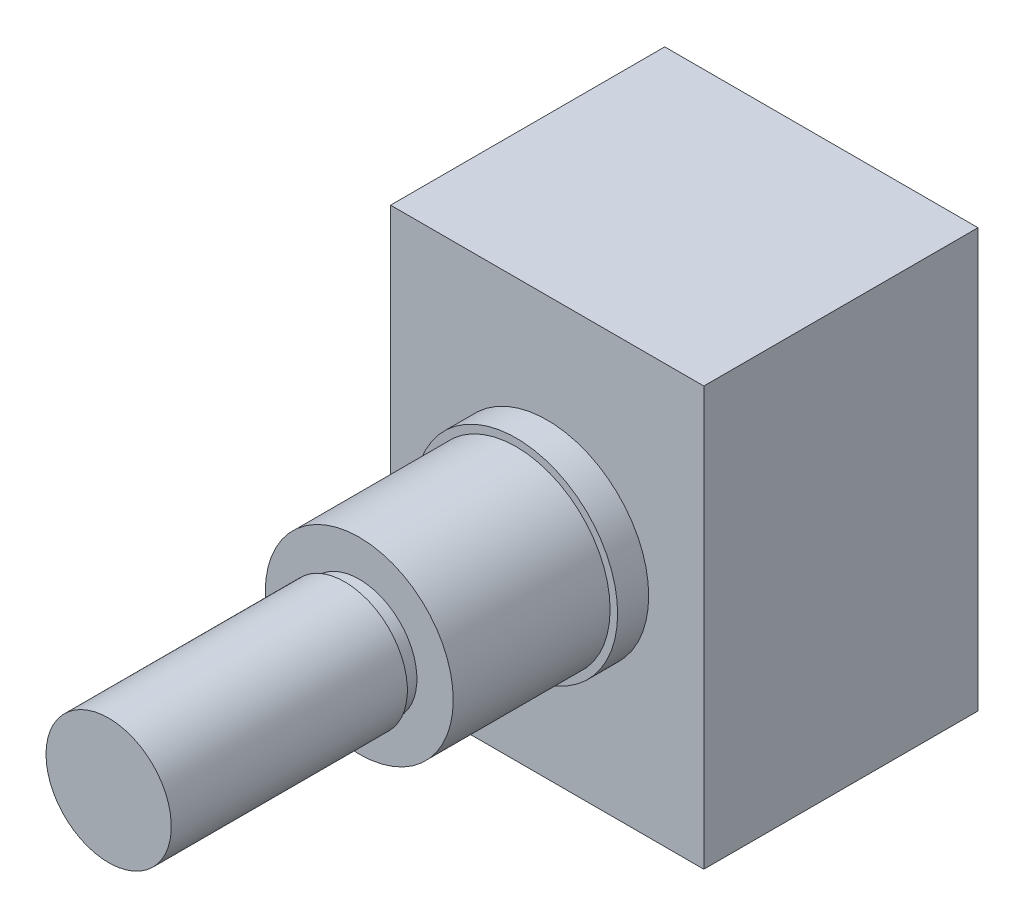
ISO-10303-21;
HEADER;
FILE_DESCRIPTION(('STEP AP214'),'2;1');
FILE_NAME('part.step','',(''),(''),'','','');
FILE_SCHEMA(('AUTOMOTIVE_DESIGN { 1 0 10303 214 1 1 1 1 }'));
ENDSEC;
DATA;
#1=APPLICATION_CONTEXT('core data for automotive mechanical design processes');
#2=APPLICATION_PROTOCOL_DEFINITION('international standard','automotive_design',2000,#1);
#3=PRODUCT_CONTEXT('',#1,'mechanical');
#4=PRODUCT('Part','Part','',(#3));
#5=PRODUCT_RELATED_PRODUCT_CATEGORY('part','',(#4));
#6=PRODUCT_DEFINITION_FORMATION('','',#4);
#7=PRODUCT_DEFINITION_CONTEXT('part definition',#1,'design');
#8=PRODUCT_DEFINITION('design','',#6,#7);
#9=PRODUCT_DEFINITION_SHAPE('','',#8);
#10=(LENGTH_UNIT() NAMED_UNIT(*) SI_UNIT(.MILLI.,.METRE.));
#11=(NAMED_UNIT(*) PLANE_ANGLE_UNIT() SI_UNIT($,.RADIAN.));
#12=(NAMED_UNIT(*) SI_UNIT($,.STERADIAN.) SOLID_ANGLE_UNIT());
#13=UNCERTAINTY_MEASURE_WITH_UNIT(LENGTH_MEASURE(1.E-05),#10,'distance_accuracy_value','');
#14=(GEOMETRIC_REPRESENTATION_CONTEXT(3) GLOBAL_UNCERTAINTY_ASSIGNED_CONTEXT((#13)) GLOBAL_UNIT_ASSIGNED_CONTEXT((#10,
#11,#12)) REPRESENTATION_CONTEXT('',''));
#15=CARTESIAN_POINT('',(0.,0.,0.));
#16=DIRECTION('',(0.,0.,1.));
#17=DIRECTION('',(1.,0.,0.));
#18=AXIS2_PLACEMENT_3D('',#15,#16,#17);
#19=CARTESIAN_POINT('',(-7.9375,-10.6045,0.));
#20=DIRECTION('',(0.,-1.,0.));
#21=DIRECTION('',(0.,0.,-1.));
#22=AXIS2_PLACEMENT_3D('',#19,#20,#21);
#23=PLANE('',#22);
#24=DIRECTION('',(1.,0.,0.));
#25=VECTOR('',#24,1.);
#26=CARTESIAN_POINT('',(-7.9375,-10.6045,13.8938));
#27=LINE('',#26,#25);
#28=CARTESIAN_POINT('',(-7.9375,-10.6045,13.8938));
#29=VERTEX_POINT('',#28);
#30=CARTESIAN_POINT('',(7.9375,-10.6045,13.8938));
#31=VERTEX_POINT('',#30);
#32=EDGE_CURVE('E98',#29,#31,#27,.T.);
#33=ORIENTED_EDGE('',*,*,#32,.F.);
#34=DIRECTION('',(0.,0.,1.));
#35=VECTOR('',#34,1.);
#36=CARTESIAN_POINT('',(-7.9375,-10.6045,0.));
#37=LINE('',#36,#35);
#38=CARTESIAN_POINT('',(-7.9375,-10.6045,0.));
#39=VERTEX_POINT('',#38);
#40=EDGE_CURVE('E11',#39,#29,#37,.T.);
#41=ORIENTED_EDGE('',*,*,#40,.F.);
#42=DIRECTION('',(1.,0.,0.));
#43=VECTOR('',#42,1.);
#44=CARTESIAN_POINT('',(-7.9375,-10.6045,0.));
#45=LINE('',#44,#43);
#46=CARTESIAN_POINT('',(7.9375,-10.6045,0.));
#47=VERTEX_POINT('',#46);
#48=EDGE_CURVE('E91',#39,#47,#45,.T.);
#49=ORIENTED_EDGE('',*,*,#48,.T.);
#50=DIRECTION('',(0.,0.,1.));
#51=VECTOR('',#50,1.);
#52=CARTESIAN_POINT('',(7.9375,-10.6045,0.));
#53=LINE('',#52,#51);
#54=EDGE_CURVE('E36',#47,#31,#53,.T.);
#55=ORIENTED_EDGE('',*,*,#54,.T.);
#56=EDGE_LOOP('',(#33,#41,#49,#55));
#57=FACE_BOUND('',#56,.T.);
#58=ADVANCED_FACE('F33',(#57),#23,.T.);
#59=CARTESIAN_POINT('',(-7.9375,10.6045,0.));
#60=DIRECTION('',(-1.,0.,0.));
#61=DIRECTION('',(0.,0.,1.));
#62=AXIS2_PLACEMENT_3D('',#59,#60,#61);
#63=PLANE('',#62);
#64=DIRECTION('',(0.,-1.,0.));
#65=VECTOR('',#64,1.);
#66=CARTESIAN_POINT('',(-7.9375,10.6045,13.8938));
#67=LINE('',#66,#65);
#68=CARTESIAN_POINT('',(-7.9375,10.6045,13.8938));
#69=VERTEX_POINT('',#68);
#70=EDGE_CURVE('E93',#69,#29,#67,.T.);
#71=ORIENTED_EDGE('',*,*,#70,.F.);
#72=DIRECTION('',(0.,0.,1.));
#73=VECTOR('',#72,1.);
#74=CARTESIAN_POINT('',(-7.9375,10.6045,0.));
#75=LINE('',#74,#73);
#76=CARTESIAN_POINT('',(-7.9375,10.6045,0.));
#77=VERTEX_POINT('',#76);
#78=EDGE_CURVE('E42',#77,#69,#75,.T.);
#79=ORIENTED_EDGE('',*,*,#78,.F.);
#80=DIRECTION('',(0.,-1.,0.));
#81=VECTOR('',#80,1.);
#82=CARTESIAN_POINT('',(-7.9375,10.6045,0.));
#83=LINE('',#82,#81);
#84=EDGE_CURVE('E88',#77,#39,#83,.T.);
#85=ORIENTED_EDGE('',*,*,#84,.T.);
#86=ORIENTED_EDGE('',*,*,#40,.T.);
#87=EDGE_LOOP('',(#71,#79,#85,#86));
#88=FACE_BOUND('',#87,.T.);
#89=ADVANCED_FACE('F109',(#88),#63,.T.);
#90=CARTESIAN_POINT('',(7.9375,10.6045,0.));
#91=DIRECTION('',(0.,1.,0.));
#92=DIRECTION('',(0.,0.,1.));
#93=AXIS2_PLACEMENT_3D('',#90,#91,#92);
#94=PLANE('',#93);
#95=DIRECTION('',(-1.,0.,0.));
#96=VECTOR('',#95,1.);
#97=CARTESIAN_POINT('',(7.9375,10.6045,13.8938));
#98=LINE('',#97,#96);
#99=CARTESIAN_POINT('',(7.9375,10.6045,13.8938));
#100=VERTEX_POINT('',#99);
#101=EDGE_CURVE('E83',#100,#69,#98,.T.);
#102=ORIENTED_EDGE('',*,*,#101,.F.);
#103=DIRECTION('',(0.,0.,1.));
#104=VECTOR('',#103,1.);
#105=CARTESIAN_POINT('',(7.9375,10.6045,0.));
#106=LINE('',#105,#104);
#107=CARTESIAN_POINT('',(7.9375,10.6045,0.));
#108=VERTEX_POINT('',#107);
#109=EDGE_CURVE('E78',#108,#100,#106,.T.);
#110=ORIENTED_EDGE('',*,*,#109,.F.);
#111=DIRECTION('',(-1.,0.,0.));
#112=VECTOR('',#111,1.);
#113=CARTESIAN_POINT('',(7.9375,10.6045,0.));
#114=LINE('',#113,#112);
#115=EDGE_CURVE('E81',#108,#77,#114,.T.);
#116=ORIENTED_EDGE('',*,*,#115,.T.);
#117=ORIENTED_EDGE('',*,*,#78,.T.);
#118=EDGE_LOOP('',(#102,#110,#116,#117));
#119=FACE_BOUND('',#118,.T.);
#120=ADVANCED_FACE('F80',(#119),#94,.T.);
#121=CARTESIAN_POINT('',(7.9375,-10.6045,0.));
#122=DIRECTION('',(1.,0.,0.));
#123=DIRECTION('',(0.,0.,-1.));
#124=AXIS2_PLACEMENT_3D('',#121,#122,#123);
#125=PLANE('',#124);
#126=DIRECTION('',(0.,1.,0.));
#127=VECTOR('',#126,1.);
#128=CARTESIAN_POINT('',(7.9375,-10.6045,13.8938));
#129=LINE('',#128,#127);
#130=EDGE_CURVE('E101',#31,#100,#129,.T.);
#131=ORIENTED_EDGE('',*,*,#130,.F.);
#132=ORIENTED_EDGE('',*,*,#54,.F.);
#133=DIRECTION('',(0.,1.,0.));
#134=VECTOR('',#133,1.);
#135=CARTESIAN_POINT('',(7.9375,-10.6045,0.));
#136=LINE('',#135,#134);
#137=EDGE_CURVE('E87',#47,#108,#136,.T.);
#138=ORIENTED_EDGE('',*,*,#137,.T.);
#139=ORIENTED_EDGE('',*,*,#109,.T.);
#140=EDGE_LOOP('',(#131,#132,#138,#139));
#141=FACE_BOUND('',#140,.T.);
#142=ADVANCED_FACE('F90',(#141),#125,.T.);
#143=CARTESIAN_POINT('',(0.,0.,0.));
#144=DIRECTION('',(0.,0.,1.));
#145=DIRECTION('',(1.,0.,0.));
#146=AXIS2_PLACEMENT_3D('',#143,#144,#145);
#147=PLANE('',#146);
#148=ORIENTED_EDGE('',*,*,#48,.F.);
#149=ORIENTED_EDGE('',*,*,#84,.F.);
#150=ORIENTED_EDGE('',*,*,#115,.F.);
#151=ORIENTED_EDGE('',*,*,#137,.F.);
#152=EDGE_LOOP('',(#148,#149,#150,#151));
#153=FACE_BOUND('',#152,.T.);
#154=ADVANCED_FACE('F86',(#153),#147,.F.);
#155=CARTESIAN_POINT('',(0.,0.,13.8938));
#156=DIRECTION('',(0.,0.,1.));
#157=DIRECTION('',(1.,0.,0.));
#158=AXIS2_PLACEMENT_3D('',#155,#156,#157);
#159=PLANE('',#158);
#160=CARTESIAN_POINT('',(0.,0.,13.8938));
#161=DIRECTION('',(0.,0.,-1.));
#162=DIRECTION('',(-1.,0.,0.));
#163=AXIS2_PLACEMENT_3D('',#160,#161,#162);
#164=CIRCLE('',#163,5.1435);
#165=CARTESIAN_POINT('',(-5.1435,0.,13.8938));
#166=VERTEX_POINT('',#165);
#167=EDGE_CURVE('E183',#166,#166,#164,.T.);
#168=ORIENTED_EDGE('',*,*,#167,.T.);
#169=EDGE_LOOP('',(#168));
#170=FACE_BOUND('',#169,.T.);
#171=ORIENTED_EDGE('',*,*,#32,.T.);
#172=ORIENTED_EDGE('',*,*,#130,.T.);
#173=ORIENTED_EDGE('',*,*,#101,.T.);
#174=ORIENTED_EDGE('',*,*,#70,.T.);
#175=EDGE_LOOP('',(#171,#172,#173,#174));
#176=FACE_BOUND('',#175,.T.);
#177=ADVANCED_FACE('F108',(#170,#176),#159,.T.);
#178=CARTESIAN_POINT('',(0.,0.,36.1188));
#179=DIRECTION('',(0.,0.,-1.));
#180=DIRECTION('',(-1.,0.,0.));
#181=AXIS2_PLACEMENT_3D('',#178,#179,#180);
#182=CYLINDRICAL_SURFACE('',#181,3.175);
#183=CARTESIAN_POINT('',(0.,0.,36.1188));
#184=DIRECTION('',(0.,0.,-1.));
#185=DIRECTION('',(-1.,0.,0.));
#186=AXIS2_PLACEMENT_3D('',#183,#184,#185);
#187=CIRCLE('',#186,3.175);
#188=CARTESIAN_POINT('',(-3.175,0.,36.1188));
#189=VERTEX_POINT('',#188);
#190=EDGE_CURVE('E102',#189,#189,#187,.T.);
#191=ORIENTED_EDGE('',*,*,#190,.T.);
#192=EDGE_LOOP('',(#191));
#193=FACE_BOUND('',#192,.T.);
#194=CARTESIAN_POINT('',(0.,0.,24.1554));
#195=DIRECTION('',(0.,0.,-1.));
#196=DIRECTION('',(-1.,0.,0.));
#197=AXIS2_PLACEMENT_3D('',#194,#195,#196);
#198=CIRCLE('',#197,3.175);
#199=CARTESIAN_POINT('',(-3.175,0.,24.1554));
#200=VERTEX_POINT('',#199);
#201=EDGE_CURVE('E164',#200,#200,#198,.T.);
#202=ORIENTED_EDGE('',*,*,#201,.F.);
#203=EDGE_LOOP('',(#202));
#204=FACE_BOUND('',#203,.T.);
#205=ADVANCED_FACE('F126',(#193,#204),#182,.T.);
#206=CARTESIAN_POINT('',(3.175,0.,36.1188));
#207=DIRECTION('',(0.,0.,1.));
#208=DIRECTION('',(1.,0.,0.));
#209=AXIS2_PLACEMENT_3D('',#206,#207,#208);
#210=PLANE('',#209);
#211=ORIENTED_EDGE('',*,*,#190,.F.);
#212=EDGE_LOOP('',(#211));
#213=FACE_BOUND('',#212,.T.);
#214=ADVANCED_FACE('F131',(#213),#210,.T.);
#215=CARTESIAN_POINT('',(0.,0.,36.1188));
#216=DIRECTION('',(0.,0.,-1.));
#217=DIRECTION('',(-1.,0.,0.));
#218=AXIS2_PLACEMENT_3D('',#215,#216,#217);
#219=CYLINDRICAL_SURFACE('',#218,5.1435);
#220=CARTESIAN_POINT('',(0.,0.,15.4686));
#221=DIRECTION('',(0.,0.,-1.));
#222=DIRECTION('',(-1.,0.,0.));
#223=AXIS2_PLACEMENT_3D('',#220,#221,#222);
#224=CIRCLE('',#223,5.1435);
#225=CARTESIAN_POINT('',(-5.1435,0.,15.4686));
#226=VERTEX_POINT('',#225);
#227=EDGE_CURVE('E180',#226,#226,#224,.T.);
#228=ORIENTED_EDGE('',*,*,#227,.T.);
#229=EDGE_LOOP('',(#228));
#230=FACE_BOUND('',#229,.T.);
#231=ORIENTED_EDGE('',*,*,#167,.F.);
#232=EDGE_LOOP('',(#231));
#233=FACE_BOUND('',#232,.T.);
#234=ADVANCED_FACE('F135',(#230,#233),#219,.T.);
#235=CARTESIAN_POINT('',(5.1435,0.,15.4686));
#236=DIRECTION('',(0.,0.,1.));
#237=DIRECTION('',(1.,0.,0.));
#238=AXIS2_PLACEMENT_3D('',#235,#236,#237);
#239=PLANE('',#238);
#240=CARTESIAN_POINT('',(0.,0.,15.4686));
#241=DIRECTION('',(0.,0.,-1.));
#242=DIRECTION('',(-1.,0.,0.));
#243=AXIS2_PLACEMENT_3D('',#240,#241,#242);
#244=CIRCLE('',#243,4.7625);
#245=CARTESIAN_POINT('',(-4.7625,0.,15.4686));
#246=VERTEX_POINT('',#245);
#247=EDGE_CURVE('E177',#246,#246,#244,.T.);
#248=ORIENTED_EDGE('',*,*,#247,.T.);
#249=EDGE_LOOP('',(#248));
#250=FACE_BOUND('',#249,.T.);
#251=ORIENTED_EDGE('',*,*,#227,.F.);
#252=EDGE_LOOP('',(#251));
#253=FACE_BOUND('',#252,.T.);
#254=ADVANCED_FACE('F139',(#250,#253),#239,.T.);
#255=CARTESIAN_POINT('',(0.,0.,36.1188));
#256=DIRECTION('',(0.,0.,-1.));
#257=DIRECTION('',(-1.,0.,0.));
#258=AXIS2_PLACEMENT_3D('',#255,#256,#257);
#259=CYLINDRICAL_SURFACE('',#258,4.7625);
#260=CARTESIAN_POINT('',(0.,0.,23.4188));
#261=DIRECTION('',(0.,0.,-1.));
#262=DIRECTION('',(-1.,0.,0.));
#263=AXIS2_PLACEMENT_3D('',#260,#261,#262);
#264=CIRCLE('',#263,4.7625);
#265=CARTESIAN_POINT('',(-4.7625,0.,23.4188));
#266=VERTEX_POINT('',#265);
#267=EDGE_CURVE('E171',#266,#266,#264,.T.);
#268=ORIENTED_EDGE('',*,*,#267,.T.);
#269=EDGE_LOOP('',(#268));
#270=FACE_BOUND('',#269,.T.);
#271=ORIENTED_EDGE('',*,*,#247,.F.);
#272=EDGE_LOOP('',(#271));
#273=FACE_BOUND('',#272,.T.);
#274=ADVANCED_FACE('F143',(#270,#273),#259,.T.);
#275=CARTESIAN_POINT('',(4.7625,0.,23.4188));
#276=DIRECTION('',(0.,0.,1.));
#277=DIRECTION('',(1.,0.,0.));
#278=AXIS2_PLACEMENT_3D('',#275,#276,#277);
#279=PLANE('',#278);
#280=CARTESIAN_POINT('',(0.,0.,23.4188));
#281=DIRECTION('',(0.,0.,-1.));
#282=DIRECTION('',(-1.,0.,0.));
#283=AXIS2_PLACEMENT_3D('',#280,#281,#282);
#284=CIRCLE('',#283,2.921);
#285=CARTESIAN_POINT('',(-2.921,0.,23.4188));
#286=VERTEX_POINT('',#285);
#287=EDGE_CURVE('E168',#286,#286,#284,.T.);
#288=ORIENTED_EDGE('',*,*,#287,.T.);
#289=EDGE_LOOP('',(#288));
#290=FACE_BOUND('',#289,.T.);
#291=ORIENTED_EDGE('',*,*,#267,.F.);
#292=EDGE_LOOP('',(#291));
#293=FACE_BOUND('',#292,.T.);
#294=ADVANCED_FACE('F147',(#290,#293),#279,.T.);
#295=CARTESIAN_POINT('',(0.,0.,36.1188));
#296=DIRECTION('',(0.,0.,-1.));
#297=DIRECTION('',(-1.,0.,0.));
#298=AXIS2_PLACEMENT_3D('',#295,#296,#297);
#299=CYLINDRICAL_SURFACE('',#298,2.921);
#300=CARTESIAN_POINT('',(0.,0.,24.1554));
#301=DIRECTION('',(0.,0.,-1.));
#302=DIRECTION('',(-1.,0.,0.));
#303=AXIS2_PLACEMENT_3D('',#300,#301,#302);
#304=CIRCLE('',#303,2.921);
#305=CARTESIAN_POINT('',(-2.921,0.,24.1554));
#306=VERTEX_POINT('',#305);
#307=EDGE_CURVE('E167',#306,#306,#304,.T.);
#308=ORIENTED_EDGE('',*,*,#307,.T.);
#309=EDGE_LOOP('',(#308));
#310=FACE_BOUND('',#309,.T.);
#311=ORIENTED_EDGE('',*,*,#287,.F.);
#312=EDGE_LOOP('',(#311));
#313=FACE_BOUND('',#312,.T.);
#314=ADVANCED_FACE('F151',(#310,#313),#299,.T.);
#315=CARTESIAN_POINT('',(2.921,0.,24.1554));
#316=DIRECTION('',(0.,0.,-1.));
#317=DIRECTION('',(-1.,0.,0.));
#318=AXIS2_PLACEMENT_3D('',#315,#316,#317);
#319=PLANE('',#318);
#320=ORIENTED_EDGE('',*,*,#201,.T.);
#321=EDGE_LOOP('',(#320));
#322=FACE_BOUND('',#321,.T.);
#323=ORIENTED_EDGE('',*,*,#307,.F.);
#324=EDGE_LOOP('',(#323));
#325=FACE_BOUND('',#324,.T.);
#326=ADVANCED_FACE('F155',(#322,#325),#319,.T.);
#327=CLOSED_SHELL('',(#58,#89,#120,#142,#154,#177,#205,#214,#234,#254,#274,#294,#314,#326));
#328=MANIFOLD_SOLID_BREP('B2',#327);
#329=ADVANCED_BREP_SHAPE_REPRESENTATION('',(#18,#328),#14);
#330=SHAPE_DEFINITION_REPRESENTATION(#9,#329);
ENDSEC;
END-ISO-10303-21;
